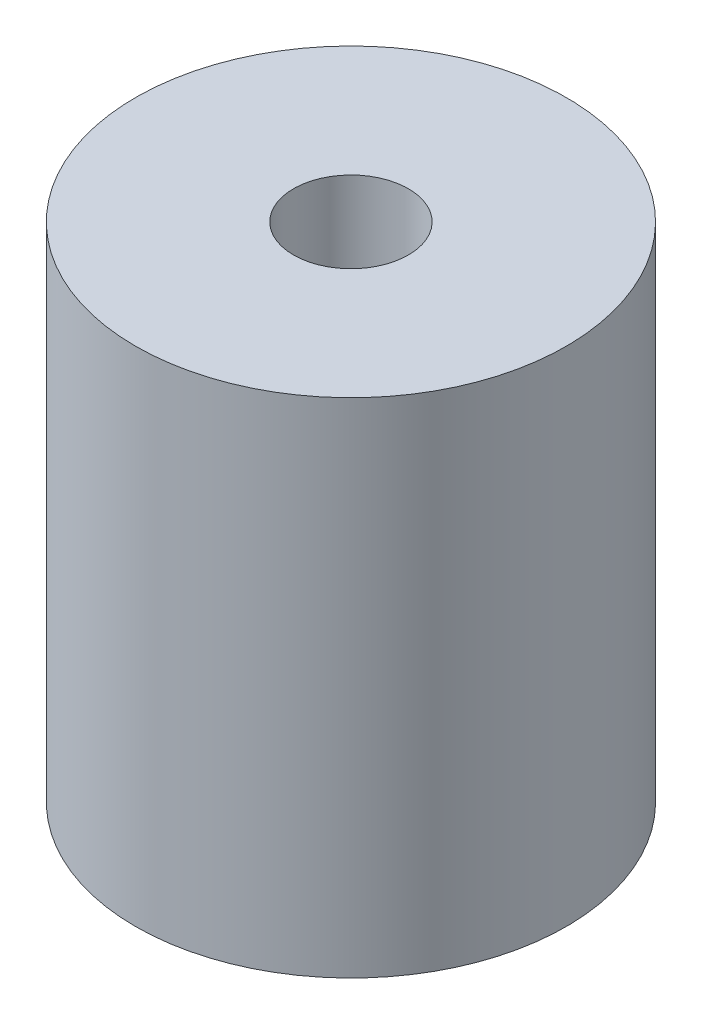
ISO-10303-21;
HEADER;
FILE_DESCRIPTION(('STEP AP214'),'2;1');
FILE_NAME('part.step','',(''),(''),'','','');
FILE_SCHEMA(('AUTOMOTIVE_DESIGN { 1 0 10303 214 1 1 1 1 }'));
ENDSEC;
DATA;
#1=APPLICATION_CONTEXT('core data for automotive mechanical design processes');
#2=APPLICATION_PROTOCOL_DEFINITION('international standard','automotive_design',2000,#1);
#3=PRODUCT_CONTEXT('',#1,'mechanical');
#4=PRODUCT('Part','Part','',(#3));
#5=PRODUCT_RELATED_PRODUCT_CATEGORY('part','',(#4));
#6=PRODUCT_DEFINITION_FORMATION('','',#4);
#7=PRODUCT_DEFINITION_CONTEXT('part definition',#1,'design');
#8=PRODUCT_DEFINITION('design','',#6,#7);
#9=PRODUCT_DEFINITION_SHAPE('','',#8);
#10=(LENGTH_UNIT() NAMED_UNIT(*) SI_UNIT(.MILLI.,.METRE.));
#11=(NAMED_UNIT(*) PLANE_ANGLE_UNIT() SI_UNIT($,.RADIAN.));
#12=(NAMED_UNIT(*) SI_UNIT($,.STERADIAN.) SOLID_ANGLE_UNIT());
#13=UNCERTAINTY_MEASURE_WITH_UNIT(LENGTH_MEASURE(1.E-05),#10,'distance_accuracy_value','');
#14=(GEOMETRIC_REPRESENTATION_CONTEXT(3) GLOBAL_UNCERTAINTY_ASSIGNED_CONTEXT((#13)) GLOBAL_UNIT_ASSIGNED_CONTEXT((#10,
#11,#12)) REPRESENTATION_CONTEXT('',''));
#15=CARTESIAN_POINT('',(0.,0.,0.));
#16=DIRECTION('',(0.,0.,1.));
#17=DIRECTION('',(1.,0.,0.));
#18=AXIS2_PLACEMENT_3D('',#15,#16,#17);
#19=CARTESIAN_POINT('',(0.,0.,0.));
#20=DIRECTION('',(0.,1.,0.));
#21=DIRECTION('',(0.,0.,1.));
#22=AXIS2_PLACEMENT_3D('',#19,#20,#21);
#23=PLANE('',#22);
#24=CARTESIAN_POINT('',(0.,0.,0.));
#25=DIRECTION('',(0.,1.,0.));
#26=DIRECTION('',(0.,0.,1.));
#27=AXIS2_PLACEMENT_3D('',#24,#25,#26);
#28=CIRCLE('',#27,15.);
#29=CARTESIAN_POINT('',(0.,0.,15.));
#30=VERTEX_POINT('',#29);
#31=EDGE_CURVE('E44',#30,#30,#28,.T.);
#32=ORIENTED_EDGE('',*,*,#31,.F.);
#33=EDGE_LOOP('',(#32));
#34=FACE_BOUND('',#33,.T.);
#35=CARTESIAN_POINT('',(0.,0.,0.));
#36=DIRECTION('',(0.,1.,0.));
#37=DIRECTION('',(0.,0.,1.));
#38=AXIS2_PLACEMENT_3D('',#35,#36,#37);
#39=CIRCLE('',#38,6.35);
#40=CARTESIAN_POINT('',(0.,0.,6.35));
#41=VERTEX_POINT('',#40);
#42=EDGE_CURVE('E48',#41,#41,#39,.T.);
#43=ORIENTED_EDGE('',*,*,#42,.T.);
#44=EDGE_LOOP('',(#43));
#45=FACE_BOUND('',#44,.T.);
#46=ADVANCED_FACE('F37',(#34,#45),#23,.F.);
#47=CARTESIAN_POINT('',(0.,11.,0.));
#48=DIRECTION('',(0.,-1.,0.));
#49=DIRECTION('',(0.,0.,-1.));
#50=AXIS2_PLACEMENT_3D('',#47,#48,#49);
#51=CYLINDRICAL_SURFACE('',#50,15.);
#52=ORIENTED_EDGE('',*,*,#31,.T.);
#53=EDGE_LOOP('',(#52));
#54=FACE_BOUND('',#53,.T.);
#55=CARTESIAN_POINT('',(0.,35.,0.));
#56=DIRECTION('',(0.,1.,0.));
#57=DIRECTION('',(0.,0.,1.));
#58=AXIS2_PLACEMENT_3D('',#55,#56,#57);
#59=CIRCLE('',#58,15.);
#60=CARTESIAN_POINT('',(0.,35.,15.));
#61=VERTEX_POINT('',#60);
#62=EDGE_CURVE('E57',#61,#61,#59,.T.);
#63=ORIENTED_EDGE('',*,*,#62,.F.);
#64=EDGE_LOOP('',(#63));
#65=FACE_BOUND('',#64,.T.);
#66=ADVANCED_FACE('F39',(#54,#65),#51,.T.);
#67=CARTESIAN_POINT('',(0.,11.,0.));
#68=DIRECTION('',(0.,-1.,0.));
#69=DIRECTION('',(0.,0.,-1.));
#70=AXIS2_PLACEMENT_3D('',#67,#68,#69);
#71=CYLINDRICAL_SURFACE('',#70,6.35);
#72=CARTESIAN_POINT('',(0.,11.,0.));
#73=DIRECTION('',(0.,1.,0.));
#74=DIRECTION('',(0.,0.,1.));
#75=AXIS2_PLACEMENT_3D('',#72,#73,#74);
#76=CIRCLE('',#75,6.35);
#77=CARTESIAN_POINT('',(0.,11.,6.35));
#78=VERTEX_POINT('',#77);
#79=EDGE_CURVE('E52',#78,#78,#76,.T.);
#80=ORIENTED_EDGE('',*,*,#79,.T.);
#81=EDGE_LOOP('',(#80));
#82=FACE_BOUND('',#81,.T.);
#83=ORIENTED_EDGE('',*,*,#42,.F.);
#84=EDGE_LOOP('',(#83));
#85=FACE_BOUND('',#84,.T.);
#86=ADVANCED_FACE('F77',(#82,#85),#71,.F.);
#87=CARTESIAN_POINT('',(0.,11.,0.));
#88=DIRECTION('',(0.,1.,0.));
#89=DIRECTION('',(0.,0.,1.));
#90=AXIS2_PLACEMENT_3D('',#87,#88,#89);
#91=PLANE('',#90);
#92=ORIENTED_EDGE('',*,*,#79,.F.);
#93=EDGE_LOOP('',(#92));
#94=FACE_BOUND('',#93,.T.);
#95=ADVANCED_FACE('F68',(#94),#91,.F.);
#96=CARTESIAN_POINT('',(0.,35.,0.));
#97=DIRECTION('',(0.,1.,0.));
#98=DIRECTION('',(0.,0.,1.));
#99=AXIS2_PLACEMENT_3D('',#96,#97,#98);
#100=PLANE('',#99);
#101=ORIENTED_EDGE('',*,*,#62,.T.);
#102=EDGE_LOOP('',(#101));
#103=FACE_BOUND('',#102,.T.);
#104=CARTESIAN_POINT('',(0.,35.,0.));
#105=DIRECTION('',(0.,1.,0.));
#106=DIRECTION('',(0.,0.,1.));
#107=AXIS2_PLACEMENT_3D('',#104,#105,#106);
#108=CIRCLE('',#107,4.);
#109=CARTESIAN_POINT('',(0.,35.,4.));
#110=VERTEX_POINT('',#109);
#111=EDGE_CURVE('E60',#110,#110,#108,.T.);
#112=ORIENTED_EDGE('',*,*,#111,.F.);
#113=EDGE_LOOP('',(#112));
#114=FACE_BOUND('',#113,.T.);
#115=ADVANCED_FACE('F66',(#103,#114),#100,.T.);
#116=CARTESIAN_POINT('',(0.,35.,0.));
#117=DIRECTION('',(0.,-1.,0.));
#118=DIRECTION('',(0.,0.,-1.));
#119=AXIS2_PLACEMENT_3D('',#116,#117,#118);
#120=CYLINDRICAL_SURFACE('',#119,4.);
#121=ORIENTED_EDGE('',*,*,#111,.T.);
#122=EDGE_LOOP('',(#121));
#123=FACE_BOUND('',#122,.T.);
#124=CARTESIAN_POINT('',(0.,24.,0.));
#125=DIRECTION('',(0.,1.,0.));
#126=DIRECTION('',(0.,0.,1.));
#127=AXIS2_PLACEMENT_3D('',#124,#125,#126);
#128=CIRCLE('',#127,4.);
#129=CARTESIAN_POINT('',(0.,24.,4.));
#130=VERTEX_POINT('',#129);
#131=EDGE_CURVE('E10',#130,#130,#128,.F.);
#132=ORIENTED_EDGE('',*,*,#131,.T.);
#133=EDGE_LOOP('',(#132));
#134=FACE_BOUND('',#133,.T.);
#135=ADVANCED_FACE('F64',(#123,#134),#120,.F.);
#136=CARTESIAN_POINT('',(0.,24.,0.));
#137=DIRECTION('',(0.,1.,0.));
#138=DIRECTION('',(0.,0.,1.));
#139=AXIS2_PLACEMENT_3D('',#136,#137,#138);
#140=PLANE('',#139);
#141=ORIENTED_EDGE('',*,*,#131,.F.);
#142=EDGE_LOOP('',(#141));
#143=FACE_BOUND('',#142,.T.);
#144=ADVANCED_FACE('F75',(#143),#140,.T.);
#145=CLOSED_SHELL('',(#46,#66,#86,#95,#115,#135,#144));
#146=MANIFOLD_SOLID_BREP('B2',#145);
#147=ADVANCED_BREP_SHAPE_REPRESENTATION('',(#18,#146),#14);
#148=SHAPE_DEFINITION_REPRESENTATION(#9,#147);
ENDSEC;
END-ISO-10303-21;
